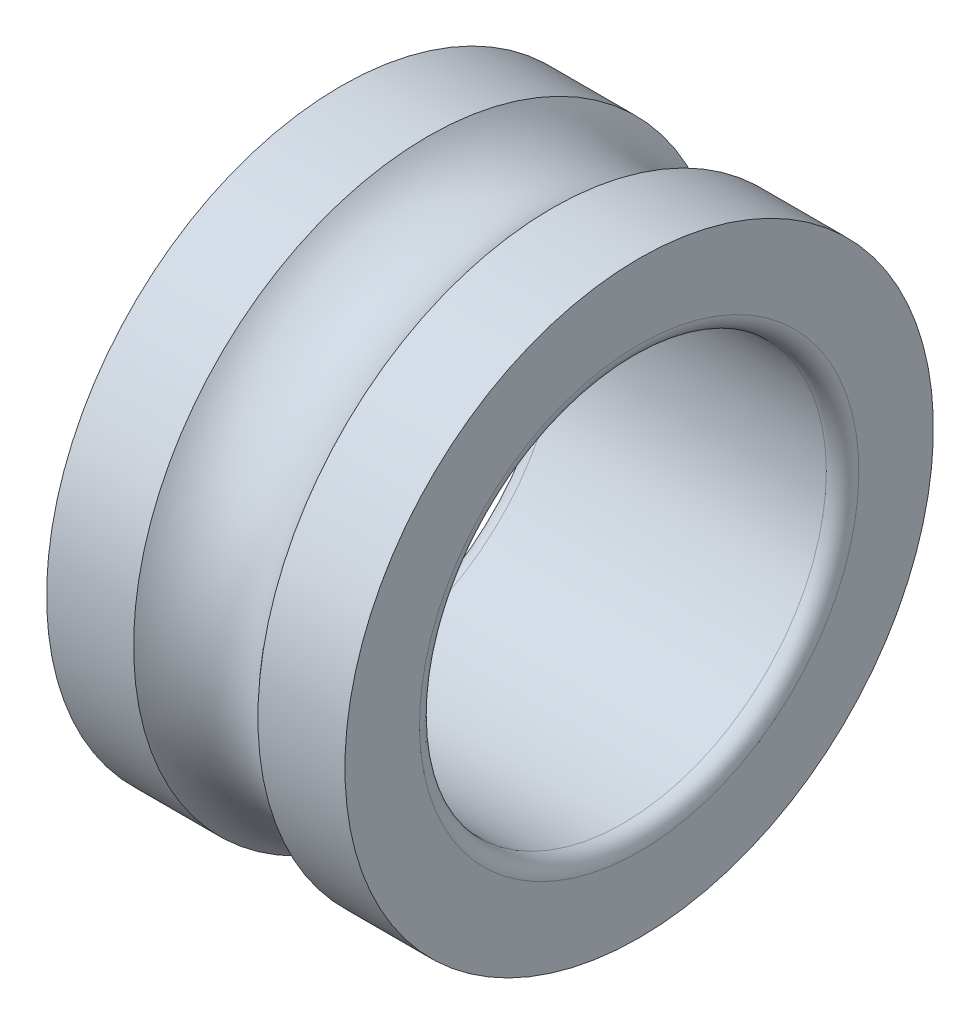
ISO-10303-21;
HEADER;
FILE_DESCRIPTION(('STEP AP214'),'2;1');
FILE_NAME('part.step','',(''),(''),'','','');
FILE_SCHEMA(('AUTOMOTIVE_DESIGN { 1 0 10303 214 1 1 1 1 }'));
ENDSEC;
DATA;
#1=APPLICATION_CONTEXT('core data for automotive mechanical design processes');
#2=APPLICATION_PROTOCOL_DEFINITION('international standard','automotive_design',2000,#1);
#3=PRODUCT_CONTEXT('',#1,'mechanical');
#4=PRODUCT('Part','Part','',(#3));
#5=PRODUCT_RELATED_PRODUCT_CATEGORY('part','',(#4));
#6=PRODUCT_DEFINITION_FORMATION('','',#4);
#7=PRODUCT_DEFINITION_CONTEXT('part definition',#1,'design');
#8=PRODUCT_DEFINITION('design','',#6,#7);
#9=PRODUCT_DEFINITION_SHAPE('','',#8);
#10=(LENGTH_UNIT() NAMED_UNIT(*) SI_UNIT(.MILLI.,.METRE.));
#11=(NAMED_UNIT(*) PLANE_ANGLE_UNIT() SI_UNIT($,.RADIAN.));
#12=(NAMED_UNIT(*) SI_UNIT($,.STERADIAN.) SOLID_ANGLE_UNIT());
#13=UNCERTAINTY_MEASURE_WITH_UNIT(LENGTH_MEASURE(1.E-05),#10,'distance_accuracy_value','');
#14=(GEOMETRIC_REPRESENTATION_CONTEXT(3) GLOBAL_UNCERTAINTY_ASSIGNED_CONTEXT((#13)) GLOBAL_UNIT_ASSIGNED_CONTEXT((#10,
#11,#12)) REPRESENTATION_CONTEXT('',''));
#15=CARTESIAN_POINT('',(0.,0.,0.));
#16=DIRECTION('',(0.,0.,1.));
#17=DIRECTION('',(1.,0.,0.));
#18=AXIS2_PLACEMENT_3D('',#15,#16,#17);
#19=CARTESIAN_POINT('',(9.39559506916711,0.,0.));
#20=DIRECTION('',(-1.,0.,0.));
#21=DIRECTION('',(0.,1.,0.));
#22=AXIS2_PLACEMENT_3D('',#19,#20,#21);
#23=CYLINDRICAL_SURFACE('',#22,10.85);
#24=CARTESIAN_POINT('',(7.79119013833423,0.,0.));
#25=DIRECTION('',(1.,0.,0.));
#26=DIRECTION('',(0.,1.,0.));
#27=AXIS2_PLACEMENT_3D('',#24,#25,#26);
#28=CIRCLE('',#27,10.85);
#29=CARTESIAN_POINT('',(7.79119013833423,10.85,0.));
#30=VERTEX_POINT('',#29);
#31=EDGE_CURVE('E11',#30,#30,#28,.T.);
#32=ORIENTED_EDGE('',*,*,#31,.T.);
#33=EDGE_LOOP('',(#32));
#34=FACE_BOUND('',#33,.T.);
#35=CARTESIAN_POINT('',(11.,0.,0.));
#36=DIRECTION('',(1.,0.,0.));
#37=DIRECTION('',(0.,1.,0.));
#38=AXIS2_PLACEMENT_3D('',#35,#36,#37);
#39=CIRCLE('',#38,10.85);
#40=CARTESIAN_POINT('',(11.,10.85,0.));
#41=VERTEX_POINT('',#40);
#42=EDGE_CURVE('E20',#41,#41,#39,.T.);
#43=ORIENTED_EDGE('',*,*,#42,.F.);
#44=EDGE_LOOP('',(#43));
#45=FACE_BOUND('',#44,.T.);
#46=ADVANCED_FACE('F16',(#34,#45),#23,.T.);
#47=CARTESIAN_POINT('',(5.5,0.,0.));
#48=DIRECTION('',(1.,0.,0.));
#49=DIRECTION('',(0.,0.,-1.));
#50=AXIS2_PLACEMENT_3D('',#47,#48,#49);
#51=TOROIDAL_SURFACE('',#50,12.75,2.9765);
#52=CARTESIAN_POINT('',(3.20880986166578,0.,0.));
#53=DIRECTION('',(1.,0.,0.));
#54=DIRECTION('',(0.,1.,0.));
#55=AXIS2_PLACEMENT_3D('',#52,#53,#54);
#56=CIRCLE('',#55,10.85);
#57=CARTESIAN_POINT('',(3.20880986166578,10.85,0.));
#58=VERTEX_POINT('',#57);
#59=EDGE_CURVE('E26',#58,#58,#56,.T.);
#60=ORIENTED_EDGE('',*,*,#59,.T.);
#61=EDGE_LOOP('',(#60));
#62=FACE_BOUND('',#61,.T.);
#63=ORIENTED_EDGE('',*,*,#31,.F.);
#64=EDGE_LOOP('',(#63));
#65=FACE_BOUND('',#64,.T.);
#66=ADVANCED_FACE('F81',(#62,#65),#51,.F.);
#67=CARTESIAN_POINT('',(1.60440493083288,0.,0.));
#68=DIRECTION('',(-1.,0.,0.));
#69=DIRECTION('',(0.,1.,0.));
#70=AXIS2_PLACEMENT_3D('',#67,#68,#69);
#71=CYLINDRICAL_SURFACE('',#70,10.85);
#72=CARTESIAN_POINT('',(0.,0.,0.));
#73=DIRECTION('',(1.,0.,0.));
#74=DIRECTION('',(0.,1.,0.));
#75=AXIS2_PLACEMENT_3D('',#72,#73,#74);
#76=CIRCLE('',#75,10.85);
#77=CARTESIAN_POINT('',(0.,10.85,0.));
#78=VERTEX_POINT('',#77);
#79=EDGE_CURVE('E62',#78,#78,#76,.T.);
#80=ORIENTED_EDGE('',*,*,#79,.T.);
#81=EDGE_LOOP('',(#80));
#82=FACE_BOUND('',#81,.T.);
#83=ORIENTED_EDGE('',*,*,#59,.F.);
#84=EDGE_LOOP('',(#83));
#85=FACE_BOUND('',#84,.T.);
#86=ADVANCED_FACE('F85',(#82,#85),#71,.T.);
#87=CARTESIAN_POINT('',(0.,9.475,0.));
#88=DIRECTION('',(-1.,0.,0.));
#89=DIRECTION('',(0.,-1.,0.));
#90=AXIS2_PLACEMENT_3D('',#87,#88,#89);
#91=PLANE('',#90);
#92=CARTESIAN_POINT('',(0.,0.,0.));
#93=DIRECTION('',(1.,0.,0.));
#94=DIRECTION('',(0.,1.,0.));
#95=AXIS2_PLACEMENT_3D('',#92,#93,#94);
#96=CIRCLE('',#95,8.1);
#97=CARTESIAN_POINT('',(0.,8.1,0.));
#98=VERTEX_POINT('',#97);
#99=EDGE_CURVE('E58',#98,#98,#96,.T.);
#100=ORIENTED_EDGE('',*,*,#99,.T.);
#101=EDGE_LOOP('',(#100));
#102=FACE_BOUND('',#101,.T.);
#103=ORIENTED_EDGE('',*,*,#79,.F.);
#104=EDGE_LOOP('',(#103));
#105=FACE_BOUND('',#104,.T.);
#106=ADVANCED_FACE('F94',(#102,#105),#91,.T.);
#107=CARTESIAN_POINT('',(0.6,0.,0.));
#108=DIRECTION('',(1.,0.,0.));
#109=DIRECTION('',(0.,0.,-1.));
#110=AXIS2_PLACEMENT_3D('',#107,#108,#109);
#111=TOROIDAL_SURFACE('',#110,8.1,0.6);
#112=CARTESIAN_POINT('',(0.6,0.,0.));
#113=DIRECTION('',(1.,0.,0.));
#114=DIRECTION('',(0.,1.,0.));
#115=AXIS2_PLACEMENT_3D('',#112,#113,#114);
#116=CIRCLE('',#115,7.5);
#117=CARTESIAN_POINT('',(0.6,7.5,0.));
#118=VERTEX_POINT('',#117);
#119=EDGE_CURVE('E56',#118,#118,#116,.T.);
#120=ORIENTED_EDGE('',*,*,#119,.T.);
#121=EDGE_LOOP('',(#120));
#122=FACE_BOUND('',#121,.T.);
#123=ORIENTED_EDGE('',*,*,#99,.F.);
#124=EDGE_LOOP('',(#123));
#125=FACE_BOUND('',#124,.T.);
#126=ADVANCED_FACE('F91',(#122,#125),#111,.T.);
#127=CARTESIAN_POINT('',(5.5,0.,0.));
#128=DIRECTION('',(-1.,0.,0.));
#129=DIRECTION('',(0.,1.,0.));
#130=AXIS2_PLACEMENT_3D('',#127,#128,#129);
#131=CYLINDRICAL_SURFACE('',#130,7.5);
#132=CARTESIAN_POINT('',(10.4,0.,0.));
#133=DIRECTION('',(1.,0.,0.));
#134=DIRECTION('',(0.,1.,0.));
#135=AXIS2_PLACEMENT_3D('',#132,#133,#134);
#136=CIRCLE('',#135,7.5);
#137=CARTESIAN_POINT('',(10.4,7.5,0.));
#138=VERTEX_POINT('',#137);
#139=EDGE_CURVE('E52',#138,#138,#136,.T.);
#140=ORIENTED_EDGE('',*,*,#139,.T.);
#141=EDGE_LOOP('',(#140));
#142=FACE_BOUND('',#141,.T.);
#143=ORIENTED_EDGE('',*,*,#119,.F.);
#144=EDGE_LOOP('',(#143));
#145=FACE_BOUND('',#144,.T.);
#146=ADVANCED_FACE('F53',(#142,#145),#131,.F.);
#147=CARTESIAN_POINT('',(10.4,0.,0.));
#148=DIRECTION('',(1.,0.,0.));
#149=DIRECTION('',(0.,0.,-1.));
#150=AXIS2_PLACEMENT_3D('',#147,#148,#149);
#151=TOROIDAL_SURFACE('',#150,8.1,0.6);
#152=CARTESIAN_POINT('',(11.,0.,0.));
#153=DIRECTION('',(1.,0.,0.));
#154=DIRECTION('',(0.,1.,0.));
#155=AXIS2_PLACEMENT_3D('',#152,#153,#154);
#156=CIRCLE('',#155,8.1);
#157=CARTESIAN_POINT('',(11.,8.1,0.));
#158=VERTEX_POINT('',#157);
#159=EDGE_CURVE('E60',#158,#158,#156,.T.);
#160=ORIENTED_EDGE('',*,*,#159,.T.);
#161=EDGE_LOOP('',(#160));
#162=FACE_BOUND('',#161,.T.);
#163=ORIENTED_EDGE('',*,*,#139,.F.);
#164=EDGE_LOOP('',(#163));
#165=FACE_BOUND('',#164,.T.);
#166=ADVANCED_FACE('F72',(#162,#165),#151,.T.);
#167=CARTESIAN_POINT('',(11.,9.475,0.));
#168=DIRECTION('',(1.,0.,0.));
#169=DIRECTION('',(0.,1.,0.));
#170=AXIS2_PLACEMENT_3D('',#167,#168,#169);
#171=PLANE('',#170);
#172=ORIENTED_EDGE('',*,*,#42,.T.);
#173=EDGE_LOOP('',(#172));
#174=FACE_BOUND('',#173,.T.);
#175=ORIENTED_EDGE('',*,*,#159,.F.);
#176=EDGE_LOOP('',(#175));
#177=FACE_BOUND('',#176,.T.);
#178=ADVANCED_FACE('F18',(#174,#177),#171,.T.);
#179=CLOSED_SHELL('',(#46,#66,#86,#106,#126,#146,#166,#178));
#180=MANIFOLD_SOLID_BREP('B1',#179);
#181=ADVANCED_BREP_SHAPE_REPRESENTATION('',(#18,#180),#14);
#182=SHAPE_DEFINITION_REPRESENTATION(#9,#181);
ENDSEC;
END-ISO-10303-21;
